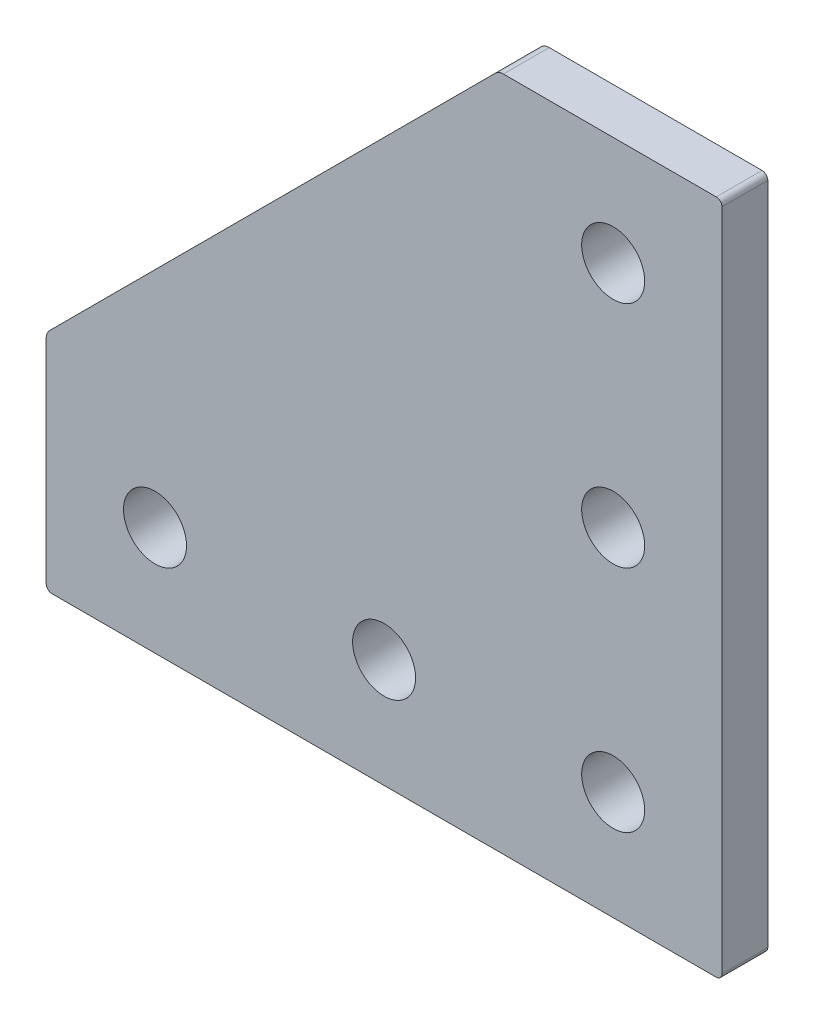
ISO-10303-21;
HEADER;
FILE_DESCRIPTION(('STEP AP214'),'2;1');
FILE_NAME('part.step','',(''),(''),'','','');
FILE_SCHEMA(('AUTOMOTIVE_DESIGN { 1 0 10303 214 1 1 1 1 }'));
ENDSEC;
DATA;
#1=APPLICATION_CONTEXT('core data for automotive mechanical design processes');
#2=APPLICATION_PROTOCOL_DEFINITION('international standard','automotive_design',2000,#1);
#3=PRODUCT_CONTEXT('',#1,'mechanical');
#4=PRODUCT('Part','Part','',(#3));
#5=PRODUCT_RELATED_PRODUCT_CATEGORY('part','',(#4));
#6=PRODUCT_DEFINITION_FORMATION('','',#4);
#7=PRODUCT_DEFINITION_CONTEXT('part definition',#1,'design');
#8=PRODUCT_DEFINITION('design','',#6,#7);
#9=PRODUCT_DEFINITION_SHAPE('','',#8);
#10=(LENGTH_UNIT() NAMED_UNIT(*) SI_UNIT(.MILLI.,.METRE.));
#11=(NAMED_UNIT(*) PLANE_ANGLE_UNIT() SI_UNIT($,.RADIAN.));
#12=(NAMED_UNIT(*) SI_UNIT($,.STERADIAN.) SOLID_ANGLE_UNIT());
#13=UNCERTAINTY_MEASURE_WITH_UNIT(LENGTH_MEASURE(1.E-05),#10,'distance_accuracy_value','');
#14=(GEOMETRIC_REPRESENTATION_CONTEXT(3) GLOBAL_UNCERTAINTY_ASSIGNED_CONTEXT((#13)) GLOBAL_UNIT_ASSIGNED_CONTEXT((#10,
#11,#12)) REPRESENTATION_CONTEXT('',''));
#15=CARTESIAN_POINT('',(0.,0.,0.));
#16=DIRECTION('',(0.,0.,1.));
#17=DIRECTION('',(1.,0.,0.));
#18=AXIS2_PLACEMENT_3D('',#15,#16,#17);
#19=CARTESIAN_POINT('',(39.9142135623719,58.0000000000012,0.));
#20=DIRECTION('',(0.,0.,1.));
#21=DIRECTION('',(1.,0.,0.));
#22=AXIS2_PLACEMENT_3D('',#19,#20,#21);
#23=CYLINDRICAL_SURFACE('',#22,1.);
#24=CARTESIAN_POINT('',(39.9142135623719,58.0000000000012,0.));
#25=DIRECTION('',(0.,0.,1.));
#26=DIRECTION('',(1.,0.,0.));
#27=AXIS2_PLACEMENT_3D('',#24,#25,#26);
#28=CIRCLE('',#27,1.);
#29=CARTESIAN_POINT('',(39.9142135623719,59.0000000000012,0.));
#30=VERTEX_POINT('',#29);
#31=CARTESIAN_POINT('',(39.2071067811853,58.7071067811877,0.));
#32=VERTEX_POINT('',#31);
#33=EDGE_CURVE('E170',#30,#32,#28,.T.);
#34=ORIENTED_EDGE('',*,*,#33,.T.);
#35=DIRECTION('',(0.,0.,1.));
#36=VECTOR('',#35,1.);
#37=CARTESIAN_POINT('',(39.2071067811853,58.7071067811877,0.));
#38=LINE('',#37,#36);
#39=CARTESIAN_POINT('',(39.2071067811853,58.7071067811877,4.));
#40=VERTEX_POINT('',#39);
#41=EDGE_CURVE('E74',#40,#32,#38,.F.);
#42=ORIENTED_EDGE('',*,*,#41,.F.);
#43=CARTESIAN_POINT('',(39.9142135623719,58.0000000000012,4.));
#44=DIRECTION('',(0.,0.,1.));
#45=DIRECTION('',(1.,0.,0.));
#46=AXIS2_PLACEMENT_3D('',#43,#44,#45);
#47=CIRCLE('',#46,1.);
#48=CARTESIAN_POINT('',(39.9142135623719,59.0000000000006,4.));
#49=VERTEX_POINT('',#48);
#50=EDGE_CURVE('E20',#40,#49,#47,.F.);
#51=ORIENTED_EDGE('',*,*,#50,.T.);
#52=DIRECTION('',(0.,0.,1.));
#53=VECTOR('',#52,1.);
#54=CARTESIAN_POINT('',(39.9142135623719,59.0000000000012,0.));
#55=LINE('',#54,#53);
#56=EDGE_CURVE('E71',#30,#49,#55,.T.);
#57=ORIENTED_EDGE('',*,*,#56,.F.);
#58=EDGE_LOOP('',(#34,#42,#51,#57));
#59=FACE_BOUND('',#58,.T.);
#60=ADVANCED_FACE('F17',(#59),#23,.T.);
#61=CARTESIAN_POINT('',(0.999999999999996,19.0857864376269,0.));
#62=DIRECTION('',(0.,0.,1.));
#63=DIRECTION('',(1.,0.,0.));
#64=AXIS2_PLACEMENT_3D('',#61,#62,#63);
#65=CYLINDRICAL_SURFACE('',#64,0.999999999999966);
#66=CARTESIAN_POINT('',(0.999999999999996,19.0857864376269,0.));
#67=DIRECTION('',(0.,0.,1.));
#68=DIRECTION('',(1.,0.,0.));
#69=AXIS2_PLACEMENT_3D('',#66,#67,#68);
#70=CIRCLE('',#69,0.999999999999966);
#71=CARTESIAN_POINT('',(0.292893218813438,19.7928932188134,0.));
#72=VERTEX_POINT('',#71);
#73=CARTESIAN_POINT('',(0.,19.0857864376269,0.));
#74=VERTEX_POINT('',#73);
#75=EDGE_CURVE('E167',#72,#74,#70,.T.);
#76=ORIENTED_EDGE('',*,*,#75,.T.);
#77=DIRECTION('',(0.,0.,1.));
#78=VECTOR('',#77,1.);
#79=CARTESIAN_POINT('',(0.,19.0857864376269,0.));
#80=LINE('',#79,#78);
#81=CARTESIAN_POINT('',(0.,19.0857864376269,4.));
#82=VERTEX_POINT('',#81);
#83=EDGE_CURVE('E113',#82,#74,#80,.F.);
#84=ORIENTED_EDGE('',*,*,#83,.F.);
#85=CARTESIAN_POINT('',(0.999999999999996,19.0857864376269,4.));
#86=DIRECTION('',(0.,0.,1.));
#87=DIRECTION('',(1.,0.,0.));
#88=AXIS2_PLACEMENT_3D('',#85,#86,#87);
#89=CIRCLE('',#88,0.999999999999966);
#90=CARTESIAN_POINT('',(0.292893218813441,19.7928932188134,4.));
#91=VERTEX_POINT('',#90);
#92=EDGE_CURVE('E76',#82,#91,#89,.F.);
#93=ORIENTED_EDGE('',*,*,#92,.T.);
#94=DIRECTION('',(0.,0.,1.));
#95=VECTOR('',#94,1.);
#96=CARTESIAN_POINT('',(0.292893218813435,19.7928932188134,0.));
#97=LINE('',#96,#95);
#98=EDGE_CURVE('E119',#72,#91,#97,.T.);
#99=ORIENTED_EDGE('',*,*,#98,.F.);
#100=EDGE_LOOP('',(#76,#84,#93,#99));
#101=FACE_BOUND('',#100,.T.);
#102=ADVANCED_FACE('F178',(#101),#65,.T.);
#103=CARTESIAN_POINT('',(0.499999999999999,0.5,0.));
#104=DIRECTION('',(0.,0.,1.));
#105=DIRECTION('',(1.,0.,0.));
#106=AXIS2_PLACEMENT_3D('',#103,#104,#105);
#107=CYLINDRICAL_SURFACE('',#106,0.5);
#108=CARTESIAN_POINT('',(0.499999999999999,0.5,0.));
#109=DIRECTION('',(0.,0.,1.));
#110=DIRECTION('',(1.,0.,0.));
#111=AXIS2_PLACEMENT_3D('',#108,#109,#110);
#112=CIRCLE('',#111,0.5);
#113=CARTESIAN_POINT('',(0.,0.5,0.));
#114=VERTEX_POINT('',#113);
#115=CARTESIAN_POINT('',(0.499999999999998,0.,0.));
#116=VERTEX_POINT('',#115);
#117=EDGE_CURVE('E164',#114,#116,#112,.T.);
#118=ORIENTED_EDGE('',*,*,#117,.T.);
#119=DIRECTION('',(0.,0.,-1.));
#120=VECTOR('',#119,1.);
#121=CARTESIAN_POINT('',(0.499999999999997,0.,0.));
#122=LINE('',#121,#120);
#123=CARTESIAN_POINT('',(0.499999999999997,0.,4.));
#124=VERTEX_POINT('',#123);
#125=EDGE_CURVE('E106',#124,#116,#122,.T.);
#126=ORIENTED_EDGE('',*,*,#125,.F.);
#127=CARTESIAN_POINT('',(0.499999999999999,0.5,4.));
#128=DIRECTION('',(0.,0.,1.));
#129=DIRECTION('',(1.,0.,0.));
#130=AXIS2_PLACEMENT_3D('',#127,#128,#129);
#131=CIRCLE('',#130,0.5);
#132=CARTESIAN_POINT('',(0.,0.5,4.));
#133=VERTEX_POINT('',#132);
#134=EDGE_CURVE('E174',#124,#133,#131,.F.);
#135=ORIENTED_EDGE('',*,*,#134,.T.);
#136=DIRECTION('',(0.,0.,1.));
#137=VECTOR('',#136,1.);
#138=CARTESIAN_POINT('',(0.,0.5,0.));
#139=LINE('',#138,#137);
#140=EDGE_CURVE('E116',#114,#133,#139,.T.);
#141=ORIENTED_EDGE('',*,*,#140,.F.);
#142=EDGE_LOOP('',(#118,#126,#135,#141));
#143=FACE_BOUND('',#142,.T.);
#144=ADVANCED_FACE('F225',(#143),#107,.T.);
#145=CARTESIAN_POINT('',(58.5,58.5,0.));
#146=DIRECTION('',(0.,0.,1.));
#147=DIRECTION('',(1.,0.,0.));
#148=AXIS2_PLACEMENT_3D('',#145,#146,#147);
#149=CYLINDRICAL_SURFACE('',#148,0.5);
#150=CARTESIAN_POINT('',(58.5,58.5,0.));
#151=DIRECTION('',(0.,0.,1.));
#152=DIRECTION('',(1.,0.,0.));
#153=AXIS2_PLACEMENT_3D('',#150,#151,#152);
#154=CIRCLE('',#153,0.5);
#155=CARTESIAN_POINT('',(59.,58.5,0.));
#156=VERTEX_POINT('',#155);
#157=CARTESIAN_POINT('',(58.5,59.,0.));
#158=VERTEX_POINT('',#157);
#159=EDGE_CURVE('E125',#156,#158,#154,.T.);
#160=ORIENTED_EDGE('',*,*,#159,.T.);
#161=DIRECTION('',(0.,0.,1.));
#162=VECTOR('',#161,1.);
#163=CARTESIAN_POINT('',(58.5,59.,0.));
#164=LINE('',#163,#162);
#165=CARTESIAN_POINT('',(58.5,59.,4.));
#166=VERTEX_POINT('',#165);
#167=EDGE_CURVE('E124',#166,#158,#164,.F.);
#168=ORIENTED_EDGE('',*,*,#167,.F.);
#169=CARTESIAN_POINT('',(58.5,58.5,4.));
#170=DIRECTION('',(0.,0.,1.));
#171=DIRECTION('',(1.,0.,0.));
#172=AXIS2_PLACEMENT_3D('',#169,#170,#171);
#173=CIRCLE('',#172,0.5);
#174=CARTESIAN_POINT('',(59.,58.5,4.));
#175=VERTEX_POINT('',#174);
#176=EDGE_CURVE('E86',#166,#175,#173,.F.);
#177=ORIENTED_EDGE('',*,*,#176,.T.);
#178=DIRECTION('',(0.,0.,-1.));
#179=VECTOR('',#178,1.);
#180=CARTESIAN_POINT('',(59.,58.5,0.));
#181=LINE('',#180,#179);
#182=EDGE_CURVE('E102',#156,#175,#181,.F.);
#183=ORIENTED_EDGE('',*,*,#182,.F.);
#184=EDGE_LOOP('',(#160,#168,#177,#183));
#185=FACE_BOUND('',#184,.T.);
#186=ADVANCED_FACE('F210',(#185),#149,.T.);
#187=CARTESIAN_POINT('',(58.5,0.499999999999999,0.));
#188=DIRECTION('',(0.,0.,1.));
#189=DIRECTION('',(1.,0.,0.));
#190=AXIS2_PLACEMENT_3D('',#187,#188,#189);
#191=CYLINDRICAL_SURFACE('',#190,0.5);
#192=CARTESIAN_POINT('',(58.5,0.499999999999999,0.));
#193=DIRECTION('',(0.,0.,1.));
#194=DIRECTION('',(1.,0.,0.));
#195=AXIS2_PLACEMENT_3D('',#192,#193,#194);
#196=CIRCLE('',#195,0.5);
#197=CARTESIAN_POINT('',(58.5,0.,0.));
#198=VERTEX_POINT('',#197);
#199=CARTESIAN_POINT('',(59.,0.499999999999998,0.));
#200=VERTEX_POINT('',#199);
#201=EDGE_CURVE('E161',#198,#200,#196,.T.);
#202=ORIENTED_EDGE('',*,*,#201,.T.);
#203=DIRECTION('',(0.,0.,-1.));
#204=VECTOR('',#203,1.);
#205=CARTESIAN_POINT('',(59.,0.499999999999997,0.));
#206=LINE('',#205,#204);
#207=CARTESIAN_POINT('',(59.,0.499999999999998,4.));
#208=VERTEX_POINT('',#207);
#209=EDGE_CURVE('E98',#208,#200,#206,.T.);
#210=ORIENTED_EDGE('',*,*,#209,.F.);
#211=CARTESIAN_POINT('',(58.5,0.499999999999999,4.));
#212=DIRECTION('',(0.,0.,1.));
#213=DIRECTION('',(1.,0.,0.));
#214=AXIS2_PLACEMENT_3D('',#211,#212,#213);
#215=CIRCLE('',#214,0.5);
#216=CARTESIAN_POINT('',(58.5,0.,4.));
#217=VERTEX_POINT('',#216);
#218=EDGE_CURVE('E35',#208,#217,#215,.F.);
#219=ORIENTED_EDGE('',*,*,#218,.T.);
#220=DIRECTION('',(0.,0.,-1.));
#221=VECTOR('',#220,1.);
#222=CARTESIAN_POINT('',(58.5,0.,0.));
#223=LINE('',#222,#221);
#224=EDGE_CURVE('E109',#198,#217,#223,.F.);
#225=ORIENTED_EDGE('',*,*,#224,.F.);
#226=EDGE_LOOP('',(#202,#210,#219,#225));
#227=FACE_BOUND('',#226,.T.);
#228=ADVANCED_FACE('F216',(#227),#191,.T.);
#229=CARTESIAN_POINT('',(34.2307879347296,24.7692120652707,0.));
#230=DIRECTION('',(0.,0.,1.));
#231=DIRECTION('',(1.,0.,0.));
#232=AXIS2_PLACEMENT_3D('',#229,#230,#231);
#233=PLANE('',#232);
#234=CARTESIAN_POINT('',(29.5,9.5,0.));
#235=DIRECTION('',(0.,0.,1.));
#236=DIRECTION('',(1.,0.,0.));
#237=AXIS2_PLACEMENT_3D('',#234,#235,#236);
#238=CIRCLE('',#237,2.75);
#239=CARTESIAN_POINT('',(32.25,9.5,0.));
#240=VERTEX_POINT('',#239);
#241=EDGE_CURVE('E129',#240,#240,#238,.T.);
#242=ORIENTED_EDGE('',*,*,#241,.T.);
#243=EDGE_LOOP('',(#242));
#244=FACE_BOUND('',#243,.T.);
#245=CARTESIAN_POINT('',(49.5,9.5,0.));
#246=DIRECTION('',(0.,0.,1.));
#247=DIRECTION('',(1.,0.,0.));
#248=AXIS2_PLACEMENT_3D('',#245,#246,#247);
#249=CIRCLE('',#248,2.75);
#250=CARTESIAN_POINT('',(52.25,9.5,0.));
#251=VERTEX_POINT('',#250);
#252=EDGE_CURVE('E154',#251,#251,#249,.T.);
#253=ORIENTED_EDGE('',*,*,#252,.T.);
#254=EDGE_LOOP('',(#253));
#255=FACE_BOUND('',#254,.T.);
#256=CARTESIAN_POINT('',(49.5,29.5,0.));
#257=DIRECTION('',(0.,0.,1.));
#258=DIRECTION('',(1.,0.,0.));
#259=AXIS2_PLACEMENT_3D('',#256,#257,#258);
#260=CIRCLE('',#259,2.75);
#261=CARTESIAN_POINT('',(52.25,29.5,0.));
#262=VERTEX_POINT('',#261);
#263=EDGE_CURVE('E151',#262,#262,#260,.T.);
#264=ORIENTED_EDGE('',*,*,#263,.T.);
#265=EDGE_LOOP('',(#264));
#266=FACE_BOUND('',#265,.T.);
#267=CARTESIAN_POINT('',(49.5,49.5,0.));
#268=DIRECTION('',(0.,0.,1.));
#269=DIRECTION('',(1.,0.,0.));
#270=AXIS2_PLACEMENT_3D('',#267,#268,#269);
#271=CIRCLE('',#270,2.75);
#272=CARTESIAN_POINT('',(52.25,49.5,0.));
#273=VERTEX_POINT('',#272);
#274=EDGE_CURVE('E94',#273,#273,#271,.T.);
#275=ORIENTED_EDGE('',*,*,#274,.T.);
#276=EDGE_LOOP('',(#275));
#277=FACE_BOUND('',#276,.T.);
#278=CARTESIAN_POINT('',(9.5,9.5,0.));
#279=DIRECTION('',(0.,0.,1.));
#280=DIRECTION('',(1.,0.,0.));
#281=AXIS2_PLACEMENT_3D('',#278,#279,#280);
#282=CIRCLE('',#281,2.75);
#283=CARTESIAN_POINT('',(12.25,9.5,0.));
#284=VERTEX_POINT('',#283);
#285=EDGE_CURVE('E89',#284,#284,#282,.T.);
#286=ORIENTED_EDGE('',*,*,#285,.T.);
#287=EDGE_LOOP('',(#286));
#288=FACE_BOUND('',#287,.T.);
#289=DIRECTION('',(0.,1.,0.));
#290=VECTOR('',#289,1.);
#291=CARTESIAN_POINT('',(59.,29.5,0.));
#292=LINE('',#291,#290);
#293=EDGE_CURVE('E101',#200,#156,#292,.T.);
#294=ORIENTED_EDGE('',*,*,#293,.F.);
#295=ORIENTED_EDGE('',*,*,#201,.F.);
#296=DIRECTION('',(1.,0.,0.));
#297=VECTOR('',#296,1.);
#298=CARTESIAN_POINT('',(29.5,0.,0.));
#299=LINE('',#298,#297);
#300=EDGE_CURVE('E105',#116,#198,#299,.T.);
#301=ORIENTED_EDGE('',*,*,#300,.F.);
#302=ORIENTED_EDGE('',*,*,#117,.F.);
#303=DIRECTION('',(0.,1.,0.));
#304=VECTOR('',#303,1.);
#305=CARTESIAN_POINT('',(0.,9.54289321881345,0.));
#306=LINE('',#305,#304);
#307=EDGE_CURVE('E112',#74,#114,#306,.F.);
#308=ORIENTED_EDGE('',*,*,#307,.F.);
#309=ORIENTED_EDGE('',*,*,#75,.F.);
#310=DIRECTION('',(-0.707106781186525,-0.70710678118657,0.));
#311=VECTOR('',#310,1.);
#312=CARTESIAN_POINT('',(19.7499999999994,39.2500000000006,0.));
#313=LINE('',#312,#311);
#314=EDGE_CURVE('E121',#32,#72,#313,.T.);
#315=ORIENTED_EDGE('',*,*,#314,.F.);
#316=ORIENTED_EDGE('',*,*,#33,.F.);
#317=DIRECTION('',(-1.,0.,0.));
#318=VECTOR('',#317,1.);
#319=CARTESIAN_POINT('',(49.457106781186,59.0000000000006,0.));
#320=LINE('',#319,#318);
#321=EDGE_CURVE('E83',#158,#30,#320,.T.);
#322=ORIENTED_EDGE('',*,*,#321,.F.);
#323=ORIENTED_EDGE('',*,*,#159,.F.);
#324=EDGE_LOOP('',(#294,#295,#301,#302,#308,#309,#315,#316,#322,#323));
#325=FACE_BOUND('',#324,.T.);
#326=ADVANCED_FACE('F191',(#244,#255,#266,#277,#288,#325),#233,.F.);
#327=CARTESIAN_POINT('',(49.457106781186,59.0000000000006,0.));
#328=DIRECTION('',(0.,1.,0.));
#329=DIRECTION('',(-1.,0.,0.));
#330=AXIS2_PLACEMENT_3D('',#327,#328,#329);
#331=PLANE('',#330);
#332=ORIENTED_EDGE('',*,*,#56,.T.);
#333=DIRECTION('',(1.,0.,0.));
#334=VECTOR('',#333,1.);
#335=CARTESIAN_POINT('',(34.2307879347296,59.,4.));
#336=LINE('',#335,#334);
#337=EDGE_CURVE('E81',#166,#49,#336,.F.);
#338=ORIENTED_EDGE('',*,*,#337,.F.);
#339=ORIENTED_EDGE('',*,*,#167,.T.);
#340=ORIENTED_EDGE('',*,*,#321,.T.);
#341=EDGE_LOOP('',(#332,#338,#339,#340));
#342=FACE_BOUND('',#341,.T.);
#343=ADVANCED_FACE('F79',(#342),#331,.T.);
#344=CARTESIAN_POINT('',(19.7499999999994,39.2500000000006,0.));
#345=DIRECTION('',(-0.70710678118657,0.707106781186525,0.));
#346=DIRECTION('',(-0.707106781186525,-0.70710678118657,0.));
#347=AXIS2_PLACEMENT_3D('',#344,#345,#346);
#348=PLANE('',#347);
#349=ORIENTED_EDGE('',*,*,#314,.T.);
#350=ORIENTED_EDGE('',*,*,#98,.T.);
#351=DIRECTION('',(-0.707106781186525,-0.70710678118657,0.));
#352=VECTOR('',#351,1.);
#353=CARTESIAN_POINT('',(39.2071067811853,58.7071067811877,4.));
#354=LINE('',#353,#352);
#355=EDGE_CURVE('E88',#40,#91,#354,.T.);
#356=ORIENTED_EDGE('',*,*,#355,.F.);
#357=ORIENTED_EDGE('',*,*,#41,.T.);
#358=EDGE_LOOP('',(#349,#350,#356,#357));
#359=FACE_BOUND('',#358,.T.);
#360=ADVANCED_FACE('F183',(#359),#348,.T.);
#361=CARTESIAN_POINT('',(0.,9.54289321881345,0.));
#362=DIRECTION('',(-1.,0.,0.));
#363=DIRECTION('',(0.,0.,1.));
#364=AXIS2_PLACEMENT_3D('',#361,#362,#363);
#365=PLANE('',#364);
#366=ORIENTED_EDGE('',*,*,#83,.T.);
#367=ORIENTED_EDGE('',*,*,#307,.T.);
#368=ORIENTED_EDGE('',*,*,#140,.T.);
#369=DIRECTION('',(0.,1.,0.));
#370=VECTOR('',#369,1.);
#371=CARTESIAN_POINT('',(0.,24.7692120652707,4.));
#372=LINE('',#371,#370);
#373=EDGE_CURVE('E91',#82,#133,#372,.F.);
#374=ORIENTED_EDGE('',*,*,#373,.F.);
#375=EDGE_LOOP('',(#366,#367,#368,#374));
#376=FACE_BOUND('',#375,.T.);
#377=ADVANCED_FACE('F227',(#376),#365,.T.);
#378=CARTESIAN_POINT('',(29.5,0.,0.));
#379=DIRECTION('',(0.,-1.,0.));
#380=DIRECTION('',(0.,0.,-1.));
#381=AXIS2_PLACEMENT_3D('',#378,#379,#380);
#382=PLANE('',#381);
#383=ORIENTED_EDGE('',*,*,#125,.T.);
#384=ORIENTED_EDGE('',*,*,#300,.T.);
#385=ORIENTED_EDGE('',*,*,#224,.T.);
#386=DIRECTION('',(1.,0.,0.));
#387=VECTOR('',#386,1.);
#388=CARTESIAN_POINT('',(34.2307879347296,0.,4.));
#389=LINE('',#388,#387);
#390=EDGE_CURVE('E223',#124,#217,#389,.T.);
#391=ORIENTED_EDGE('',*,*,#390,.F.);
#392=EDGE_LOOP('',(#383,#384,#385,#391));
#393=FACE_BOUND('',#392,.T.);
#394=ADVANCED_FACE('F220',(#393),#382,.T.);
#395=CARTESIAN_POINT('',(59.,29.5,0.));
#396=DIRECTION('',(1.,0.,0.));
#397=DIRECTION('',(0.,0.,-1.));
#398=AXIS2_PLACEMENT_3D('',#395,#396,#397);
#399=PLANE('',#398);
#400=ORIENTED_EDGE('',*,*,#209,.T.);
#401=ORIENTED_EDGE('',*,*,#293,.T.);
#402=ORIENTED_EDGE('',*,*,#182,.T.);
#403=DIRECTION('',(0.,1.,0.));
#404=VECTOR('',#403,1.);
#405=CARTESIAN_POINT('',(59.,24.7692120652707,4.));
#406=LINE('',#405,#404);
#407=EDGE_CURVE('E147',#208,#175,#406,.T.);
#408=ORIENTED_EDGE('',*,*,#407,.F.);
#409=EDGE_LOOP('',(#400,#401,#402,#408));
#410=FACE_BOUND('',#409,.T.);
#411=ADVANCED_FACE('F214',(#410),#399,.T.);
#412=CARTESIAN_POINT('',(29.5,9.5,0.));
#413=DIRECTION('',(0.,0.,1.));
#414=DIRECTION('',(1.,0.,0.));
#415=AXIS2_PLACEMENT_3D('',#412,#413,#414);
#416=CYLINDRICAL_SURFACE('',#415,2.75);
#417=ORIENTED_EDGE('',*,*,#241,.F.);
#418=EDGE_LOOP('',(#417));
#419=FACE_BOUND('',#418,.T.);
#420=CARTESIAN_POINT('',(29.5,9.5,4.));
#421=DIRECTION('',(0.,0.,1.));
#422=DIRECTION('',(1.,0.,0.));
#423=AXIS2_PLACEMENT_3D('',#420,#421,#422);
#424=CIRCLE('',#423,2.75);
#425=CARTESIAN_POINT('',(32.25,9.5,4.));
#426=VERTEX_POINT('',#425);
#427=EDGE_CURVE('E145',#426,#426,#424,.F.);
#428=ORIENTED_EDGE('',*,*,#427,.F.);
#429=EDGE_LOOP('',(#428));
#430=FACE_BOUND('',#429,.T.);
#431=ADVANCED_FACE('F261',(#419,#430),#416,.F.);
#432=CARTESIAN_POINT('',(49.5,9.5,0.));
#433=DIRECTION('',(0.,0.,1.));
#434=DIRECTION('',(1.,0.,0.));
#435=AXIS2_PLACEMENT_3D('',#432,#433,#434);
#436=CYLINDRICAL_SURFACE('',#435,2.75);
#437=ORIENTED_EDGE('',*,*,#252,.F.);
#438=EDGE_LOOP('',(#437));
#439=FACE_BOUND('',#438,.T.);
#440=CARTESIAN_POINT('',(49.5,9.5,4.));
#441=DIRECTION('',(0.,0.,1.));
#442=DIRECTION('',(1.,0.,0.));
#443=AXIS2_PLACEMENT_3D('',#440,#441,#442);
#444=CIRCLE('',#443,2.75);
#445=CARTESIAN_POINT('',(52.25,9.5,4.));
#446=VERTEX_POINT('',#445);
#447=EDGE_CURVE('E142',#446,#446,#444,.F.);
#448=ORIENTED_EDGE('',*,*,#447,.F.);
#449=EDGE_LOOP('',(#448));
#450=FACE_BOUND('',#449,.T.);
#451=ADVANCED_FACE('F257',(#439,#450),#436,.F.);
#452=CARTESIAN_POINT('',(49.5,29.5,0.));
#453=DIRECTION('',(0.,0.,1.));
#454=DIRECTION('',(1.,0.,0.));
#455=AXIS2_PLACEMENT_3D('',#452,#453,#454);
#456=CYLINDRICAL_SURFACE('',#455,2.75);
#457=ORIENTED_EDGE('',*,*,#263,.F.);
#458=EDGE_LOOP('',(#457));
#459=FACE_BOUND('',#458,.T.);
#460=CARTESIAN_POINT('',(49.5,29.5,4.));
#461=DIRECTION('',(0.,0.,1.));
#462=DIRECTION('',(1.,0.,0.));
#463=AXIS2_PLACEMENT_3D('',#460,#461,#462);
#464=CIRCLE('',#463,2.75);
#465=CARTESIAN_POINT('',(52.25,29.5,4.));
#466=VERTEX_POINT('',#465);
#467=EDGE_CURVE('E139',#466,#466,#464,.F.);
#468=ORIENTED_EDGE('',*,*,#467,.F.);
#469=EDGE_LOOP('',(#468));
#470=FACE_BOUND('',#469,.T.);
#471=ADVANCED_FACE('F253',(#459,#470),#456,.F.);
#472=CARTESIAN_POINT('',(49.5,49.5,0.));
#473=DIRECTION('',(0.,0.,1.));
#474=DIRECTION('',(1.,0.,0.));
#475=AXIS2_PLACEMENT_3D('',#472,#473,#474);
#476=CYLINDRICAL_SURFACE('',#475,2.75);
#477=ORIENTED_EDGE('',*,*,#274,.F.);
#478=EDGE_LOOP('',(#477));
#479=FACE_BOUND('',#478,.T.);
#480=CARTESIAN_POINT('',(49.5,49.5,4.));
#481=DIRECTION('',(0.,0.,1.));
#482=DIRECTION('',(1.,0.,0.));
#483=AXIS2_PLACEMENT_3D('',#480,#481,#482);
#484=CIRCLE('',#483,2.75);
#485=CARTESIAN_POINT('',(52.25,49.5,4.));
#486=VERTEX_POINT('',#485);
#487=EDGE_CURVE('E26',#486,#486,#484,.F.);
#488=ORIENTED_EDGE('',*,*,#487,.F.);
#489=EDGE_LOOP('',(#488));
#490=FACE_BOUND('',#489,.T.);
#491=ADVANCED_FACE('F246',(#479,#490),#476,.F.);
#492=CARTESIAN_POINT('',(9.5,9.5,0.));
#493=DIRECTION('',(0.,0.,1.));
#494=DIRECTION('',(1.,0.,0.));
#495=AXIS2_PLACEMENT_3D('',#492,#493,#494);
#496=CYLINDRICAL_SURFACE('',#495,2.75);
#497=ORIENTED_EDGE('',*,*,#285,.F.);
#498=EDGE_LOOP('',(#497));
#499=FACE_BOUND('',#498,.T.);
#500=CARTESIAN_POINT('',(9.5,9.5,4.));
#501=DIRECTION('',(0.,0.,1.));
#502=DIRECTION('',(1.,0.,0.));
#503=AXIS2_PLACEMENT_3D('',#500,#501,#502);
#504=CIRCLE('',#503,2.75);
#505=CARTESIAN_POINT('',(12.25,9.5,4.));
#506=VERTEX_POINT('',#505);
#507=EDGE_CURVE('E11',#506,#506,#504,.F.);
#508=ORIENTED_EDGE('',*,*,#507,.F.);
#509=EDGE_LOOP('',(#508));
#510=FACE_BOUND('',#509,.T.);
#511=ADVANCED_FACE('F240',(#499,#510),#496,.F.);
#512=CARTESIAN_POINT('',(34.2307879347296,24.7692120652707,4.));
#513=DIRECTION('',(0.,0.,1.));
#514=DIRECTION('',(1.,0.,0.));
#515=AXIS2_PLACEMENT_3D('',#512,#513,#514);
#516=PLANE('',#515);
#517=ORIENTED_EDGE('',*,*,#507,.T.);
#518=EDGE_LOOP('',(#517));
#519=FACE_BOUND('',#518,.T.);
#520=ORIENTED_EDGE('',*,*,#487,.T.);
#521=EDGE_LOOP('',(#520));
#522=FACE_BOUND('',#521,.T.);
#523=ORIENTED_EDGE('',*,*,#467,.T.);
#524=EDGE_LOOP('',(#523));
#525=FACE_BOUND('',#524,.T.);
#526=ORIENTED_EDGE('',*,*,#447,.T.);
#527=EDGE_LOOP('',(#526));
#528=FACE_BOUND('',#527,.T.);
#529=ORIENTED_EDGE('',*,*,#427,.T.);
#530=EDGE_LOOP('',(#529));
#531=FACE_BOUND('',#530,.T.);
#532=ORIENTED_EDGE('',*,*,#218,.F.);
#533=ORIENTED_EDGE('',*,*,#407,.T.);
#534=ORIENTED_EDGE('',*,*,#176,.F.);
#535=ORIENTED_EDGE('',*,*,#337,.T.);
#536=ORIENTED_EDGE('',*,*,#50,.F.);
#537=ORIENTED_EDGE('',*,*,#355,.T.);
#538=ORIENTED_EDGE('',*,*,#92,.F.);
#539=ORIENTED_EDGE('',*,*,#373,.T.);
#540=ORIENTED_EDGE('',*,*,#134,.F.);
#541=ORIENTED_EDGE('',*,*,#390,.T.);
#542=EDGE_LOOP('',(#532,#533,#534,#535,#536,#537,#538,#539,#540,#541));
#543=FACE_BOUND('',#542,.T.);
#544=ADVANCED_FACE('F85',(#519,#522,#525,#528,#531,#543),#516,.T.);
#545=CLOSED_SHELL('',(#60,#102,#144,#186,#228,#326,#343,#360,#377,#394,#411,#431,#451,#471,#491,
#511,#544));
#546=MANIFOLD_SOLID_BREP('B1',#545);
#547=ADVANCED_BREP_SHAPE_REPRESENTATION('',(#18,#546),#14);
#548=SHAPE_DEFINITION_REPRESENTATION(#9,#547);
ENDSEC;
END-ISO-10303-21;
